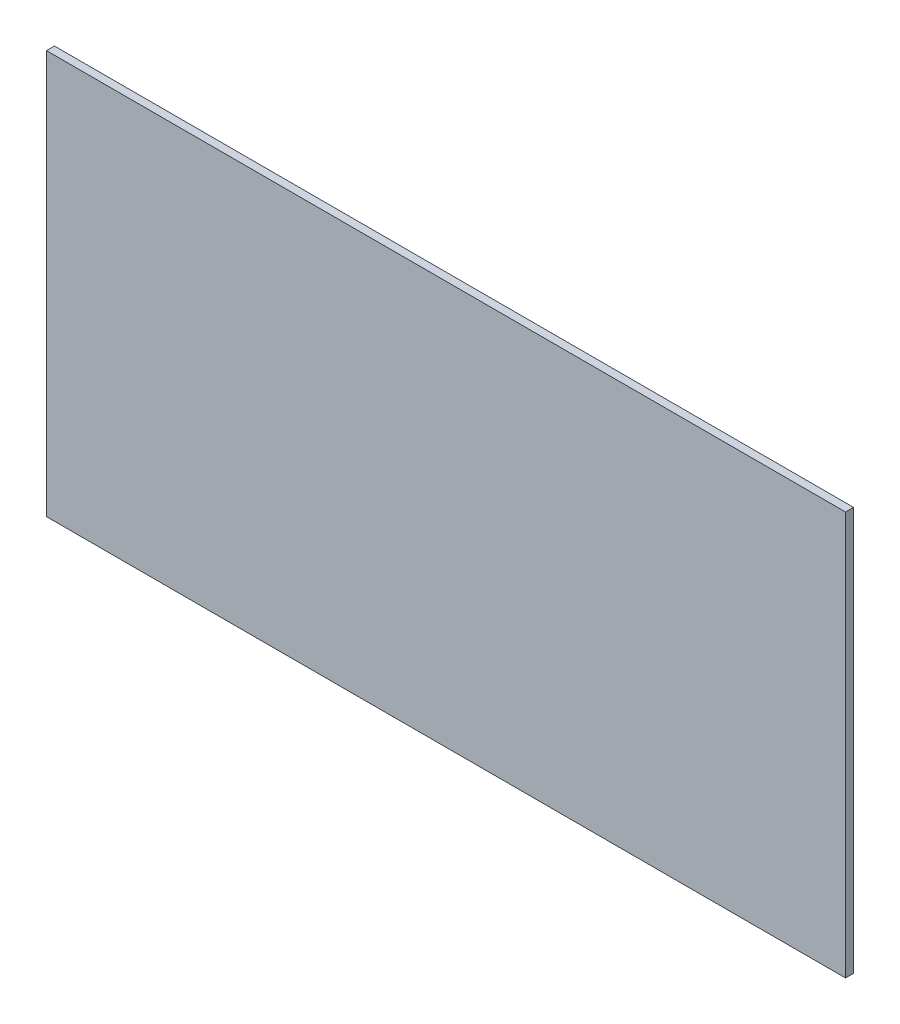
ISO-10303-21;
HEADER;
FILE_DESCRIPTION(('STEP AP214'),'2;1');
FILE_NAME('part.step','',(''),(''),'','','');
FILE_SCHEMA(('AUTOMOTIVE_DESIGN { 1 0 10303 214 1 1 1 1 }'));
ENDSEC;
DATA;
#1=APPLICATION_CONTEXT('core data for automotive mechanical design processes');
#2=APPLICATION_PROTOCOL_DEFINITION('international standard','automotive_design',2000,#1);
#3=PRODUCT_CONTEXT('',#1,'mechanical');
#4=PRODUCT('Part','Part','',(#3));
#5=PRODUCT_RELATED_PRODUCT_CATEGORY('part','',(#4));
#6=PRODUCT_DEFINITION_FORMATION('','',#4);
#7=PRODUCT_DEFINITION_CONTEXT('part definition',#1,'design');
#8=PRODUCT_DEFINITION('design','',#6,#7);
#9=PRODUCT_DEFINITION_SHAPE('','',#8);
#10=(LENGTH_UNIT() NAMED_UNIT(*) SI_UNIT(.MILLI.,.METRE.));
#11=(NAMED_UNIT(*) PLANE_ANGLE_UNIT() SI_UNIT($,.RADIAN.));
#12=(NAMED_UNIT(*) SI_UNIT($,.STERADIAN.) SOLID_ANGLE_UNIT());
#13=UNCERTAINTY_MEASURE_WITH_UNIT(LENGTH_MEASURE(1.E-05),#10,'distance_accuracy_value','');
#14=(GEOMETRIC_REPRESENTATION_CONTEXT(3) GLOBAL_UNCERTAINTY_ASSIGNED_CONTEXT((#13)) GLOBAL_UNIT_ASSIGNED_CONTEXT((#10,
#11,#12)) REPRESENTATION_CONTEXT('',''));
#15=CARTESIAN_POINT('',(0.,0.,0.));
#16=DIRECTION('',(0.,0.,1.));
#17=DIRECTION('',(1.,0.,0.));
#18=AXIS2_PLACEMENT_3D('',#15,#16,#17);
#19=CARTESIAN_POINT('',(127.,64.135,1.27));
#20=DIRECTION('',(-1.,0.,0.));
#21=DIRECTION('',(0.,-1.,0.));
#22=AXIS2_PLACEMENT_3D('',#19,#20,#21);
#23=PLANE('',#22);
#24=DIRECTION('',(0.,1.,0.));
#25=VECTOR('',#24,1.);
#26=CARTESIAN_POINT('',(127.,64.135,-1.27));
#27=LINE('',#26,#25);
#28=CARTESIAN_POINT('',(127.,-64.135,-1.27));
#29=VERTEX_POINT('',#28);
#30=CARTESIAN_POINT('',(127.,64.135,-1.27));
#31=VERTEX_POINT('',#30);
#32=EDGE_CURVE('E95',#29,#31,#27,.T.);
#33=ORIENTED_EDGE('',*,*,#32,.T.);
#34=DIRECTION('',(0.,0.,-1.));
#35=VECTOR('',#34,1.);
#36=CARTESIAN_POINT('',(127.,64.135,1.27));
#37=LINE('',#36,#35);
#38=CARTESIAN_POINT('',(127.,64.135,1.27));
#39=VERTEX_POINT('',#38);
#40=EDGE_CURVE('E11',#39,#31,#37,.T.);
#41=ORIENTED_EDGE('',*,*,#40,.F.);
#42=DIRECTION('',(0.,1.,0.));
#43=VECTOR('',#42,1.);
#44=CARTESIAN_POINT('',(127.,64.135,1.27));
#45=LINE('',#44,#43);
#46=CARTESIAN_POINT('',(127.,-64.135,1.27));
#47=VERTEX_POINT('',#46);
#48=EDGE_CURVE('E83',#47,#39,#45,.T.);
#49=ORIENTED_EDGE('',*,*,#48,.F.);
#50=DIRECTION('',(0.,0.,-1.));
#51=VECTOR('',#50,1.);
#52=CARTESIAN_POINT('',(127.,-64.135,1.27));
#53=LINE('',#52,#51);
#54=EDGE_CURVE('E91',#47,#29,#53,.T.);
#55=ORIENTED_EDGE('',*,*,#54,.T.);
#56=EDGE_LOOP('',(#33,#41,#49,#55));
#57=FACE_BOUND('',#56,.T.);
#58=ADVANCED_FACE('F32',(#57),#23,.F.);
#59=CARTESIAN_POINT('',(-127.,64.135,1.27));
#60=DIRECTION('',(0.,-1.,0.));
#61=DIRECTION('',(0.,0.,-1.));
#62=AXIS2_PLACEMENT_3D('',#59,#60,#61);
#63=PLANE('',#62);
#64=DIRECTION('',(-1.,0.,0.));
#65=VECTOR('',#64,1.);
#66=CARTESIAN_POINT('',(-127.,64.135,-1.27));
#67=LINE('',#66,#65);
#68=CARTESIAN_POINT('',(-127.,64.135,-1.27));
#69=VERTEX_POINT('',#68);
#70=EDGE_CURVE('E87',#31,#69,#67,.T.);
#71=ORIENTED_EDGE('',*,*,#70,.T.);
#72=DIRECTION('',(0.,0.,-1.));
#73=VECTOR('',#72,1.);
#74=CARTESIAN_POINT('',(-127.,64.135,1.27));
#75=LINE('',#74,#73);
#76=CARTESIAN_POINT('',(-127.,64.135,1.27));
#77=VERTEX_POINT('',#76);
#78=EDGE_CURVE('E40',#77,#69,#75,.T.);
#79=ORIENTED_EDGE('',*,*,#78,.F.);
#80=DIRECTION('',(-1.,0.,0.));
#81=VECTOR('',#80,1.);
#82=CARTESIAN_POINT('',(-127.,64.135,1.27));
#83=LINE('',#82,#81);
#84=EDGE_CURVE('E78',#39,#77,#83,.T.);
#85=ORIENTED_EDGE('',*,*,#84,.F.);
#86=ORIENTED_EDGE('',*,*,#40,.T.);
#87=EDGE_LOOP('',(#71,#79,#85,#86));
#88=FACE_BOUND('',#87,.T.);
#89=ADVANCED_FACE('F86',(#88),#63,.F.);
#90=CARTESIAN_POINT('',(-127.,64.135,1.27));
#91=DIRECTION('',(1.,0.,0.));
#92=DIRECTION('',(0.,1.,0.));
#93=AXIS2_PLACEMENT_3D('',#90,#91,#92);
#94=PLANE('',#93);
#95=DIRECTION('',(0.,-1.,0.));
#96=VECTOR('',#95,1.);
#97=CARTESIAN_POINT('',(-127.,64.135,-1.27));
#98=LINE('',#97,#96);
#99=CARTESIAN_POINT('',(-127.,-64.135,-1.27));
#100=VERTEX_POINT('',#99);
#101=EDGE_CURVE('E65',#69,#100,#98,.T.);
#102=ORIENTED_EDGE('',*,*,#101,.T.);
#103=DIRECTION('',(0.,0.,-1.));
#104=VECTOR('',#103,1.);
#105=CARTESIAN_POINT('',(-127.,-64.135,1.27));
#106=LINE('',#105,#104);
#107=CARTESIAN_POINT('',(-127.,-64.135,1.27));
#108=VERTEX_POINT('',#107);
#109=EDGE_CURVE('E88',#108,#100,#106,.T.);
#110=ORIENTED_EDGE('',*,*,#109,.F.);
#111=DIRECTION('',(0.,-1.,0.));
#112=VECTOR('',#111,1.);
#113=CARTESIAN_POINT('',(-127.,64.135,1.27));
#114=LINE('',#113,#112);
#115=EDGE_CURVE('E81',#77,#108,#114,.T.);
#116=ORIENTED_EDGE('',*,*,#115,.F.);
#117=ORIENTED_EDGE('',*,*,#78,.T.);
#118=EDGE_LOOP('',(#102,#110,#116,#117));
#119=FACE_BOUND('',#118,.T.);
#120=ADVANCED_FACE('F89',(#119),#94,.F.);
#121=CARTESIAN_POINT('',(-127.,-64.135,1.27));
#122=DIRECTION('',(0.,1.,0.));
#123=DIRECTION('',(0.,0.,1.));
#124=AXIS2_PLACEMENT_3D('',#121,#122,#123);
#125=PLANE('',#124);
#126=DIRECTION('',(1.,0.,0.));
#127=VECTOR('',#126,1.);
#128=CARTESIAN_POINT('',(-127.,-64.135,-1.27));
#129=LINE('',#128,#127);
#130=EDGE_CURVE('E71',#100,#29,#129,.T.);
#131=ORIENTED_EDGE('',*,*,#130,.T.);
#132=ORIENTED_EDGE('',*,*,#54,.F.);
#133=DIRECTION('',(1.,0.,0.));
#134=VECTOR('',#133,1.);
#135=CARTESIAN_POINT('',(-127.,-64.135,1.27));
#136=LINE('',#135,#134);
#137=EDGE_CURVE('E48',#108,#47,#136,.T.);
#138=ORIENTED_EDGE('',*,*,#137,.F.);
#139=ORIENTED_EDGE('',*,*,#109,.T.);
#140=EDGE_LOOP('',(#131,#132,#138,#139));
#141=FACE_BOUND('',#140,.T.);
#142=ADVANCED_FACE('F102',(#141),#125,.F.);
#143=CARTESIAN_POINT('',(0.,0.,1.27));
#144=DIRECTION('',(0.,0.,1.));
#145=DIRECTION('',(1.,0.,0.));
#146=AXIS2_PLACEMENT_3D('',#143,#144,#145);
#147=PLANE('',#146);
#148=ORIENTED_EDGE('',*,*,#48,.T.);
#149=ORIENTED_EDGE('',*,*,#84,.T.);
#150=ORIENTED_EDGE('',*,*,#115,.T.);
#151=ORIENTED_EDGE('',*,*,#137,.T.);
#152=EDGE_LOOP('',(#148,#149,#150,#151));
#153=FACE_BOUND('',#152,.T.);
#154=ADVANCED_FACE('F79',(#153),#147,.T.);
#155=CARTESIAN_POINT('',(0.,0.,-1.27));
#156=DIRECTION('',(0.,0.,1.));
#157=DIRECTION('',(1.,0.,0.));
#158=AXIS2_PLACEMENT_3D('',#155,#156,#157);
#159=PLANE('',#158);
#160=ORIENTED_EDGE('',*,*,#32,.F.);
#161=ORIENTED_EDGE('',*,*,#130,.F.);
#162=ORIENTED_EDGE('',*,*,#101,.F.);
#163=ORIENTED_EDGE('',*,*,#70,.F.);
#164=EDGE_LOOP('',(#160,#161,#162,#163));
#165=FACE_BOUND('',#164,.T.);
#166=ADVANCED_FACE('F105',(#165),#159,.F.);
#167=CLOSED_SHELL('',(#58,#89,#120,#142,#154,#166));
#168=MANIFOLD_SOLID_BREP('B2',#167);
#169=ADVANCED_BREP_SHAPE_REPRESENTATION('',(#18,#168),#14);
#170=SHAPE_DEFINITION_REPRESENTATION(#9,#169);
ENDSEC;
END-ISO-10303-21;
